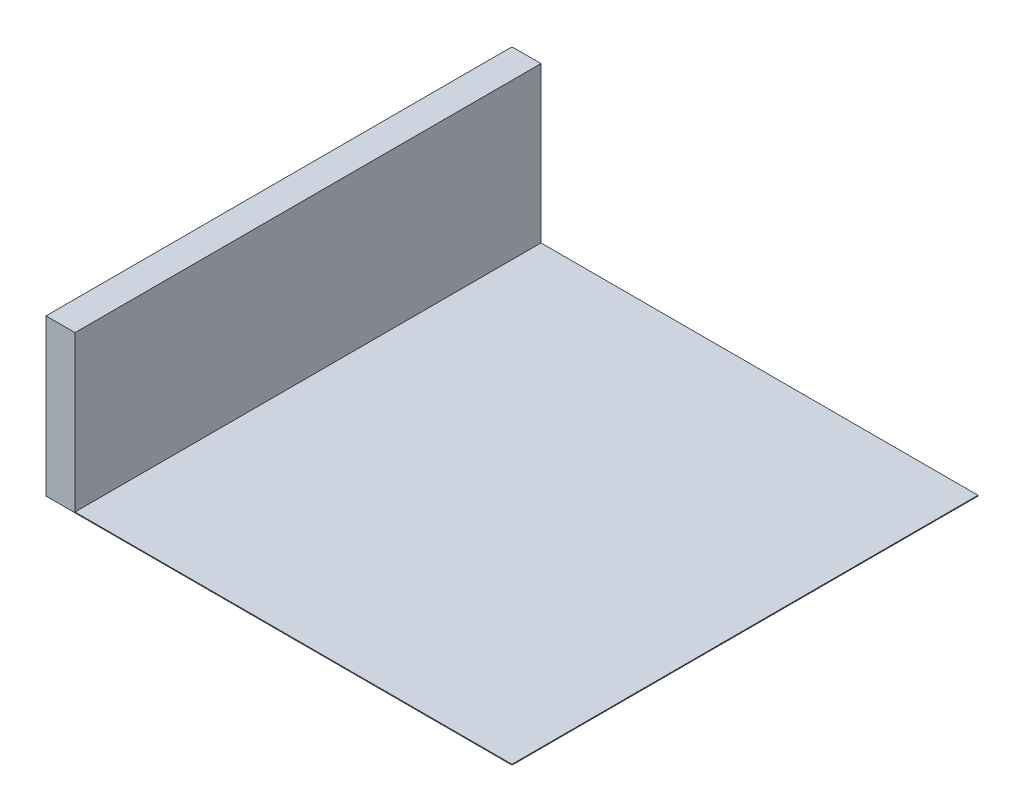
ISO-10303-21;
HEADER;
FILE_DESCRIPTION(('STEP AP214'),'2;1');
FILE_NAME('part.step','',(''),(''),'','','');
FILE_SCHEMA(('AUTOMOTIVE_DESIGN { 1 0 10303 214 1 1 1 1 }'));
ENDSEC;
DATA;
#1=APPLICATION_CONTEXT('core data for automotive mechanical design processes');
#2=APPLICATION_PROTOCOL_DEFINITION('international standard','automotive_design',2000,#1);
#3=PRODUCT_CONTEXT('',#1,'mechanical');
#4=PRODUCT('Part','Part','',(#3));
#5=PRODUCT_RELATED_PRODUCT_CATEGORY('part','',(#4));
#6=PRODUCT_DEFINITION_FORMATION('','',#4);
#7=PRODUCT_DEFINITION_CONTEXT('part definition',#1,'design');
#8=PRODUCT_DEFINITION('design','',#6,#7);
#9=PRODUCT_DEFINITION_SHAPE('','',#8);
#10=(LENGTH_UNIT() NAMED_UNIT(*) SI_UNIT(.MILLI.,.METRE.));
#11=(NAMED_UNIT(*) PLANE_ANGLE_UNIT() SI_UNIT($,.RADIAN.));
#12=(NAMED_UNIT(*) SI_UNIT($,.STERADIAN.) SOLID_ANGLE_UNIT());
#13=UNCERTAINTY_MEASURE_WITH_UNIT(LENGTH_MEASURE(1.E-05),#10,'distance_accuracy_value','');
#14=(GEOMETRIC_REPRESENTATION_CONTEXT(3) GLOBAL_UNCERTAINTY_ASSIGNED_CONTEXT((#13)) GLOBAL_UNIT_ASSIGNED_CONTEXT((#10,
#11,#12)) REPRESENTATION_CONTEXT('',''));
#15=CARTESIAN_POINT('',(0.,0.,0.));
#16=DIRECTION('',(0.,0.,1.));
#17=DIRECTION('',(1.,0.,0.));
#18=AXIS2_PLACEMENT_3D('',#15,#16,#17);
#19=CARTESIAN_POINT('',(-127.14209878788,2.54,-934.481056945143));
#20=DIRECTION('',(1.,0.,0.));
#21=DIRECTION('',(0.,0.,-1.));
#22=AXIS2_PLACEMENT_3D('',#19,#20,#21);
#23=PLANE('',#22);
#24=DIRECTION('',(0.,0.,1.));
#25=VECTOR('',#24,1.);
#26=CARTESIAN_POINT('',(-127.14209878788,0.,-934.481056945143));
#27=LINE('',#26,#25);
#28=CARTESIAN_POINT('',(-127.14209878788,0.,-934.481056945143));
#29=VERTEX_POINT('',#28);
#30=CARTESIAN_POINT('',(-127.14209878788,0.,565.518943054857));
#31=VERTEX_POINT('',#30);
#32=EDGE_CURVE('E84',#29,#31,#27,.T.);
#33=ORIENTED_EDGE('',*,*,#32,.T.);
#34=DIRECTION('',(0.,-1.,0.));
#35=VECTOR('',#34,1.);
#36=CARTESIAN_POINT('',(-127.14209878788,2.54,565.518943054857));
#37=LINE('',#36,#35);
#38=CARTESIAN_POINT('',(-127.14209878788,502.54,565.518943054857));
#39=VERTEX_POINT('',#38);
#40=EDGE_CURVE('E11',#39,#31,#37,.T.);
#41=ORIENTED_EDGE('',*,*,#40,.F.);
#42=DIRECTION('',(0.,0.,1.));
#43=VECTOR('',#42,1.);
#44=CARTESIAN_POINT('',(-127.14209878788,502.54,-934.481056945143));
#45=LINE('',#44,#43);
#46=CARTESIAN_POINT('',(-127.14209878788,502.54,-934.481056945143));
#47=VERTEX_POINT('',#46);
#48=EDGE_CURVE('E86',#47,#39,#45,.T.);
#49=ORIENTED_EDGE('',*,*,#48,.F.);
#50=DIRECTION('',(0.,-1.,0.));
#51=VECTOR('',#50,1.);
#52=CARTESIAN_POINT('',(-127.14209878788,2.54,-934.481056945143));
#53=LINE('',#52,#51);
#54=EDGE_CURVE('E81',#47,#29,#53,.T.);
#55=ORIENTED_EDGE('',*,*,#54,.T.);
#56=EDGE_LOOP('',(#33,#41,#49,#55));
#57=FACE_BOUND('',#56,.T.);
#58=ADVANCED_FACE('F39',(#57),#23,.F.);
#59=CARTESIAN_POINT('',(-127.14209878788,2.54,565.518943054857));
#60=DIRECTION('',(0.,0.,-1.));
#61=DIRECTION('',(-1.,0.,0.));
#62=AXIS2_PLACEMENT_3D('',#59,#60,#61);
#63=PLANE('',#62);
#64=DIRECTION('',(1.,0.,0.));
#65=VECTOR('',#64,1.);
#66=CARTESIAN_POINT('',(-127.14209878788,0.,565.518943054857));
#67=LINE('',#66,#65);
#68=CARTESIAN_POINT('',(1372.85790121212,0.,565.518943054857));
#69=VERTEX_POINT('',#68);
#70=EDGE_CURVE('E99',#31,#69,#67,.T.);
#71=ORIENTED_EDGE('',*,*,#70,.T.);
#72=DIRECTION('',(0.,-1.,0.));
#73=VECTOR('',#72,1.);
#74=CARTESIAN_POINT('',(1372.85790121212,2.54,565.518943054857));
#75=LINE('',#74,#73);
#76=CARTESIAN_POINT('',(1372.85790121212,2.54,565.518943054857));
#77=VERTEX_POINT('',#76);
#78=EDGE_CURVE('E47',#77,#69,#75,.T.);
#79=ORIENTED_EDGE('',*,*,#78,.F.);
#80=DIRECTION('',(1.,0.,0.));
#81=VECTOR('',#80,1.);
#82=CARTESIAN_POINT('',(-127.14209878788,2.54,565.518943054857));
#83=LINE('',#82,#81);
#84=CARTESIAN_POINT('',(-33.7455435122252,2.54,565.518943054857));
#85=VERTEX_POINT('',#84);
#86=EDGE_CURVE('E106',#85,#77,#83,.T.);
#87=ORIENTED_EDGE('',*,*,#86,.F.);
#88=DIRECTION('',(0.,-1.,0.));
#89=VECTOR('',#88,1.);
#90=CARTESIAN_POINT('',(-33.7455435122251,502.54,565.518943054857));
#91=LINE('',#90,#89);
#92=CARTESIAN_POINT('',(-33.7455435122251,502.54,565.518943054857));
#93=VERTEX_POINT('',#92);
#94=EDGE_CURVE('E101',#93,#85,#91,.T.);
#95=ORIENTED_EDGE('',*,*,#94,.F.);
#96=DIRECTION('',(1.,0.,0.));
#97=VECTOR('',#96,1.);
#98=CARTESIAN_POINT('',(-127.14209878788,502.54,565.518943054857));
#99=LINE('',#98,#97);
#100=EDGE_CURVE('E147',#39,#93,#99,.T.);
#101=ORIENTED_EDGE('',*,*,#100,.F.);
#102=ORIENTED_EDGE('',*,*,#40,.T.);
#103=EDGE_LOOP('',(#71,#79,#87,#95,#101,#102));
#104=FACE_BOUND('',#103,.T.);
#105=ADVANCED_FACE('F124',(#104),#63,.F.);
#106=CARTESIAN_POINT('',(1372.85790121212,2.54,-934.481056945143));
#107=DIRECTION('',(1.,0.,0.));
#108=DIRECTION('',(0.,0.,-1.));
#109=AXIS2_PLACEMENT_3D('',#106,#107,#108);
#110=PLANE('',#109);
#111=DIRECTION('',(0.,0.,1.));
#112=VECTOR('',#111,1.);
#113=CARTESIAN_POINT('',(1372.85790121212,0.,-934.481056945143));
#114=LINE('',#113,#112);
#115=CARTESIAN_POINT('',(1372.85790121212,0.,-934.481056945143));
#116=VERTEX_POINT('',#115);
#117=EDGE_CURVE('E107',#116,#69,#114,.T.);
#118=ORIENTED_EDGE('',*,*,#117,.F.);
#119=DIRECTION('',(0.,-1.,0.));
#120=VECTOR('',#119,1.);
#121=CARTESIAN_POINT('',(1372.85790121212,2.54,-934.481056945143));
#122=LINE('',#121,#120);
#123=CARTESIAN_POINT('',(1372.85790121212,2.54,-934.481056945143));
#124=VERTEX_POINT('',#123);
#125=EDGE_CURVE('E91',#124,#116,#122,.T.);
#126=ORIENTED_EDGE('',*,*,#125,.F.);
#127=DIRECTION('',(0.,0.,1.));
#128=VECTOR('',#127,1.);
#129=CARTESIAN_POINT('',(1372.85790121212,2.54,-934.481056945143));
#130=LINE('',#129,#128);
#131=EDGE_CURVE('E111',#124,#77,#130,.T.);
#132=ORIENTED_EDGE('',*,*,#131,.T.);
#133=ORIENTED_EDGE('',*,*,#78,.T.);
#134=EDGE_LOOP('',(#118,#126,#132,#133));
#135=FACE_BOUND('',#134,.T.);
#136=ADVANCED_FACE('F121',(#135),#110,.T.);
#137=CARTESIAN_POINT('',(-127.14209878788,2.54,-934.481056945143));
#138=DIRECTION('',(0.,0.,-1.));
#139=DIRECTION('',(-1.,0.,0.));
#140=AXIS2_PLACEMENT_3D('',#137,#138,#139);
#141=PLANE('',#140);
#142=DIRECTION('',(1.,0.,0.));
#143=VECTOR('',#142,1.);
#144=CARTESIAN_POINT('',(-127.14209878788,0.,-934.481056945143));
#145=LINE('',#144,#143);
#146=EDGE_CURVE('E97',#29,#116,#145,.T.);
#147=ORIENTED_EDGE('',*,*,#146,.F.);
#148=ORIENTED_EDGE('',*,*,#54,.F.);
#149=DIRECTION('',(-1.,0.,0.));
#150=VECTOR('',#149,1.);
#151=CARTESIAN_POINT('',(-127.14209878788,502.54,-934.481056945143));
#152=LINE('',#151,#150);
#153=CARTESIAN_POINT('',(-33.7455435122253,502.54,-934.481056945143));
#154=VERTEX_POINT('',#153);
#155=EDGE_CURVE('E138',#154,#47,#152,.T.);
#156=ORIENTED_EDGE('',*,*,#155,.F.);
#157=DIRECTION('',(0.,-1.,0.));
#158=VECTOR('',#157,1.);
#159=CARTESIAN_POINT('',(-33.7455435122253,502.54,-934.481056945143));
#160=LINE('',#159,#158);
#161=CARTESIAN_POINT('',(-33.7455435122253,2.54,-934.481056945143));
#162=VERTEX_POINT('',#161);
#163=EDGE_CURVE('E135',#154,#162,#160,.T.);
#164=ORIENTED_EDGE('',*,*,#163,.T.);
#165=DIRECTION('',(1.,0.,0.));
#166=VECTOR('',#165,1.);
#167=CARTESIAN_POINT('',(-127.14209878788,2.54,-934.481056945143));
#168=LINE('',#167,#166);
#169=EDGE_CURVE('E62',#162,#124,#168,.T.);
#170=ORIENTED_EDGE('',*,*,#169,.T.);
#171=ORIENTED_EDGE('',*,*,#125,.T.);
#172=EDGE_LOOP('',(#147,#148,#156,#164,#170,#171));
#173=FACE_BOUND('',#172,.T.);
#174=ADVANCED_FACE('F103',(#173),#141,.T.);
#175=CARTESIAN_POINT('',(0.,2.54,0.));
#176=DIRECTION('',(0.,1.,0.));
#177=DIRECTION('',(0.,0.,1.));
#178=AXIS2_PLACEMENT_3D('',#175,#176,#177);
#179=PLANE('',#178);
#180=DIRECTION('',(0.,0.,-1.));
#181=VECTOR('',#180,1.);
#182=CARTESIAN_POINT('',(-33.7455435122253,2.54,-934.481056945143));
#183=LINE('',#182,#181);
#184=EDGE_CURVE('E54',#85,#162,#183,.T.);
#185=ORIENTED_EDGE('',*,*,#184,.F.);
#186=ORIENTED_EDGE('',*,*,#86,.T.);
#187=ORIENTED_EDGE('',*,*,#131,.F.);
#188=ORIENTED_EDGE('',*,*,#169,.F.);
#189=EDGE_LOOP('',(#185,#186,#187,#188));
#190=FACE_BOUND('',#189,.T.);
#191=ADVANCED_FACE('F167',(#190),#179,.T.);
#192=CARTESIAN_POINT('',(0.,0.,0.));
#193=DIRECTION('',(0.,1.,0.));
#194=DIRECTION('',(0.,0.,1.));
#195=AXIS2_PLACEMENT_3D('',#192,#193,#194);
#196=PLANE('',#195);
#197=ORIENTED_EDGE('',*,*,#32,.F.);
#198=ORIENTED_EDGE('',*,*,#146,.T.);
#199=ORIENTED_EDGE('',*,*,#117,.T.);
#200=ORIENTED_EDGE('',*,*,#70,.F.);
#201=EDGE_LOOP('',(#197,#198,#199,#200));
#202=FACE_BOUND('',#201,.T.);
#203=ADVANCED_FACE('F95',(#202),#196,.F.);
#204=CARTESIAN_POINT('',(-33.7455435122253,502.54,-934.481056945143));
#205=DIRECTION('',(-1.,0.,0.));
#206=DIRECTION('',(0.,0.,1.));
#207=AXIS2_PLACEMENT_3D('',#204,#205,#206);
#208=PLANE('',#207);
#209=ORIENTED_EDGE('',*,*,#184,.T.);
#210=ORIENTED_EDGE('',*,*,#163,.F.);
#211=DIRECTION('',(0.,0.,-1.));
#212=VECTOR('',#211,1.);
#213=CARTESIAN_POINT('',(-33.7455435122253,502.54,-934.481056945143));
#214=LINE('',#213,#212);
#215=EDGE_CURVE('E143',#93,#154,#214,.T.);
#216=ORIENTED_EDGE('',*,*,#215,.F.);
#217=ORIENTED_EDGE('',*,*,#94,.T.);
#218=EDGE_LOOP('',(#209,#210,#216,#217));
#219=FACE_BOUND('',#218,.T.);
#220=ADVANCED_FACE('F166',(#219),#208,.F.);
#221=CARTESIAN_POINT('',(0.,502.54,0.));
#222=DIRECTION('',(0.,1.,0.));
#223=DIRECTION('',(0.,0.,1.));
#224=AXIS2_PLACEMENT_3D('',#221,#222,#223);
#225=PLANE('',#224);
#226=ORIENTED_EDGE('',*,*,#48,.T.);
#227=ORIENTED_EDGE('',*,*,#100,.T.);
#228=ORIENTED_EDGE('',*,*,#215,.T.);
#229=ORIENTED_EDGE('',*,*,#155,.T.);
#230=EDGE_LOOP('',(#226,#227,#228,#229));
#231=FACE_BOUND('',#230,.T.);
#232=ADVANCED_FACE('F154',(#231),#225,.T.);
#233=CLOSED_SHELL('',(#58,#105,#136,#174,#191,#203,#220,#232));
#234=MANIFOLD_SOLID_BREP('B2',#233);
#235=ADVANCED_BREP_SHAPE_REPRESENTATION('',(#18,#234),#14);
#236=SHAPE_DEFINITION_REPRESENTATION(#9,#235);
ENDSEC;
END-ISO-10303-21;
